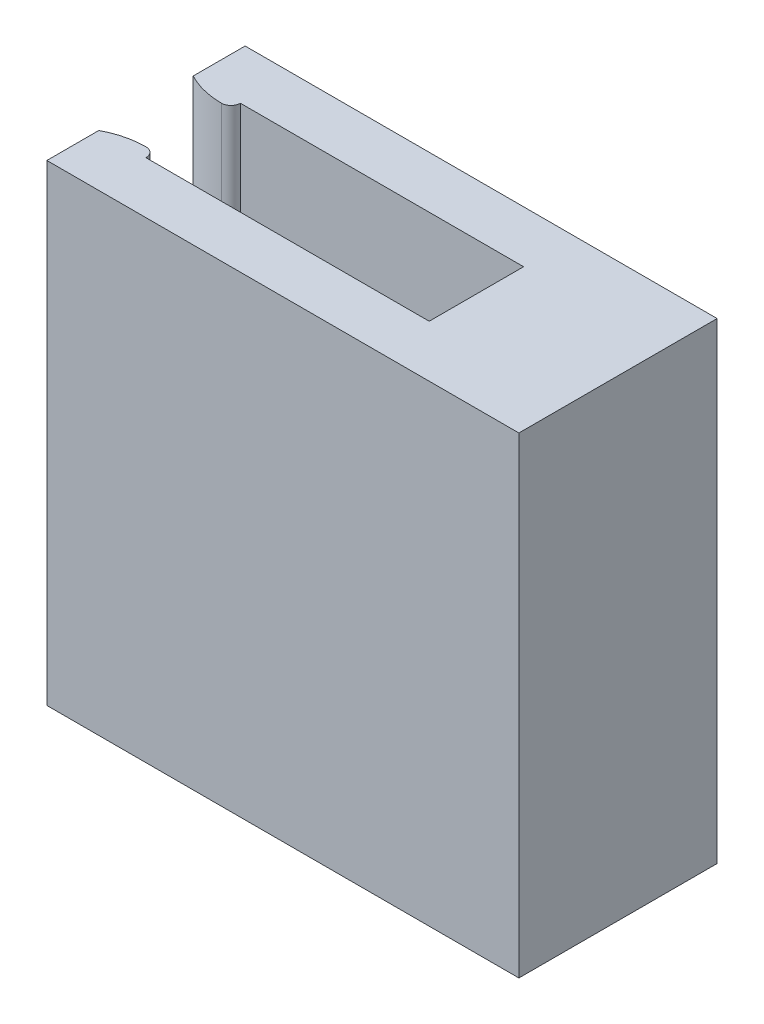
ISO-10303-21;
HEADER;
FILE_DESCRIPTION(('STEP AP214'),'2;1');
FILE_NAME('part.step','',(''),(''),'','','');
FILE_SCHEMA(('AUTOMOTIVE_DESIGN { 1 0 10303 214 1 1 1 1 }'));
ENDSEC;
DATA;
#1=APPLICATION_CONTEXT('core data for automotive mechanical design processes');
#2=APPLICATION_PROTOCOL_DEFINITION('international standard','automotive_design',2000,#1);
#3=PRODUCT_CONTEXT('',#1,'mechanical');
#4=PRODUCT('Part','Part','',(#3));
#5=PRODUCT_RELATED_PRODUCT_CATEGORY('part','',(#4));
#6=PRODUCT_DEFINITION_FORMATION('','',#4);
#7=PRODUCT_DEFINITION_CONTEXT('part definition',#1,'design');
#8=PRODUCT_DEFINITION('design','',#6,#7);
#9=PRODUCT_DEFINITION_SHAPE('','',#8);
#10=(LENGTH_UNIT() NAMED_UNIT(*) SI_UNIT(.MILLI.,.METRE.));
#11=(NAMED_UNIT(*) PLANE_ANGLE_UNIT() SI_UNIT($,.RADIAN.));
#12=(NAMED_UNIT(*) SI_UNIT($,.STERADIAN.) SOLID_ANGLE_UNIT());
#13=UNCERTAINTY_MEASURE_WITH_UNIT(LENGTH_MEASURE(1.E-05),#10,'distance_accuracy_value','');
#14=(GEOMETRIC_REPRESENTATION_CONTEXT(3) GLOBAL_UNCERTAINTY_ASSIGNED_CONTEXT((#13)) GLOBAL_UNIT_ASSIGNED_CONTEXT((#10,
#11,#12)) REPRESENTATION_CONTEXT('',''));
#15=CARTESIAN_POINT('',(0.,0.,0.));
#16=DIRECTION('',(0.,0.,1.));
#17=DIRECTION('',(1.,0.,0.));
#18=AXIS2_PLACEMENT_3D('',#15,#16,#17);
#19=CARTESIAN_POINT('',(-15.,25.,37.5));
#20=DIRECTION('',(0.,0.,-1.));
#21=DIRECTION('',(-1.,0.,0.));
#22=AXIS2_PLACEMENT_3D('',#19,#20,#21);
#23=PLANE('',#22);
#24=DIRECTION('',(1.,0.,0.));
#25=VECTOR('',#24,1.);
#26=CARTESIAN_POINT('',(-15.,-25.,37.5));
#27=LINE('',#26,#25);
#28=CARTESIAN_POINT('',(-25.,-25.,37.5));
#29=VERTEX_POINT('',#28);
#30=CARTESIAN_POINT('',(-15.,-25.,37.5));
#31=VERTEX_POINT('',#30);
#32=EDGE_CURVE('E11',#29,#31,#27,.T.);
#33=ORIENTED_EDGE('',*,*,#32,.T.);
#34=DIRECTION('',(0.,1.,0.));
#35=VECTOR('',#34,1.);
#36=CARTESIAN_POINT('',(-15.,-25.,37.5));
#37=LINE('',#36,#35);
#38=CARTESIAN_POINT('',(-15.,-15.,37.5));
#39=VERTEX_POINT('',#38);
#40=EDGE_CURVE('E167',#31,#39,#37,.T.);
#41=ORIENTED_EDGE('',*,*,#40,.T.);
#42=DIRECTION('',(-1.,0.,0.));
#43=VECTOR('',#42,1.);
#44=CARTESIAN_POINT('',(0.,-15.,37.5));
#45=LINE('',#44,#43);
#46=CARTESIAN_POINT('',(-25.,-15.,37.5));
#47=VERTEX_POINT('',#46);
#48=EDGE_CURVE('E230',#39,#47,#45,.T.);
#49=ORIENTED_EDGE('',*,*,#48,.T.);
#50=DIRECTION('',(0.,-1.,0.));
#51=VECTOR('',#50,1.);
#52=CARTESIAN_POINT('',(-25.,-15.,37.5));
#53=LINE('',#52,#51);
#54=EDGE_CURVE('E201',#47,#29,#53,.T.);
#55=ORIENTED_EDGE('',*,*,#54,.T.);
#56=EDGE_LOOP('',(#33,#41,#49,#55));
#57=FACE_BOUND('',#56,.T.);
#58=ADVANCED_FACE('F45',(#57),#23,.F.);
#59=CARTESIAN_POINT('',(0.,-25.,0.));
#60=DIRECTION('',(0.,1.,0.));
#61=DIRECTION('',(0.,0.,1.));
#62=AXIS2_PLACEMENT_3D('',#59,#60,#61);
#63=PLANE('',#62);
#64=DIRECTION('',(1.,0.,0.));
#65=VECTOR('',#64,1.);
#66=CARTESIAN_POINT('',(0.,-25.,33.3));
#67=LINE('',#66,#65);
#68=CARTESIAN_POINT('',(-25.,-25.,33.3));
#69=VERTEX_POINT('',#68);
#70=CARTESIAN_POINT('',(-15.,-25.,33.3));
#71=VERTEX_POINT('',#70);
#72=EDGE_CURVE('E166',#69,#71,#67,.T.);
#73=ORIENTED_EDGE('',*,*,#72,.T.);
#74=DIRECTION('',(0.,0.,1.));
#75=VECTOR('',#74,1.);
#76=CARTESIAN_POINT('',(-15.,-25.,-37.5));
#77=LINE('',#76,#75);
#78=EDGE_CURVE('E241',#71,#31,#77,.T.);
#79=ORIENTED_EDGE('',*,*,#78,.T.);
#80=ORIENTED_EDGE('',*,*,#32,.F.);
#81=DIRECTION('',(0.,0.,-1.));
#82=VECTOR('',#81,1.);
#83=CARTESIAN_POINT('',(-25.,-25.,0.));
#84=LINE('',#83,#82);
#85=CARTESIAN_POINT('',(-25.,-25.,36.4));
#86=VERTEX_POINT('',#85);
#87=EDGE_CURVE('E170',#29,#86,#84,.T.);
#88=ORIENTED_EDGE('',*,*,#87,.T.);
#89=CARTESIAN_POINT('',(-24.2,-25.,37.9));
#90=DIRECTION('',(0.,-1.,0.));
#91=DIRECTION('',(0.,0.,-1.));
#92=AXIS2_PLACEMENT_3D('',#89,#90,#91);
#93=CIRCLE('',#92,1.69999999999999);
#94=CARTESIAN_POINT('',(-24.2,-25.,36.2));
#95=VERTEX_POINT('',#94);
#96=EDGE_CURVE('E173',#86,#95,#93,.T.);
#97=ORIENTED_EDGE('',*,*,#96,.T.);
#98=CARTESIAN_POINT('',(-24.2,-25.,36.4));
#99=DIRECTION('',(0.,-1.,0.));
#100=DIRECTION('',(0.,0.,-1.));
#101=AXIS2_PLACEMENT_3D('',#98,#99,#100);
#102=CIRCLE('',#101,0.199999999999999);
#103=CARTESIAN_POINT('',(-24.,-25.,36.4));
#104=VERTEX_POINT('',#103);
#105=EDGE_CURVE('E176',#95,#104,#102,.T.);
#106=ORIENTED_EDGE('',*,*,#105,.T.);
#107=DIRECTION('',(1.,0.,0.));
#108=VECTOR('',#107,1.);
#109=CARTESIAN_POINT('',(0.,-25.,36.4));
#110=LINE('',#109,#108);
#111=CARTESIAN_POINT('',(-18.,-25.,36.4));
#112=VERTEX_POINT('',#111);
#113=EDGE_CURVE('E179',#104,#112,#110,.T.);
#114=ORIENTED_EDGE('',*,*,#113,.T.);
#115=DIRECTION('',(0.,0.,-1.));
#116=VECTOR('',#115,1.);
#117=CARTESIAN_POINT('',(-18.0000000000001,-25.,0.));
#118=LINE('',#117,#116);
#119=CARTESIAN_POINT('',(-18.,-25.,34.4));
#120=VERTEX_POINT('',#119);
#121=EDGE_CURVE('E182',#112,#120,#118,.T.);
#122=ORIENTED_EDGE('',*,*,#121,.T.);
#123=DIRECTION('',(-1.,0.,0.));
#124=VECTOR('',#123,1.);
#125=CARTESIAN_POINT('',(0.,-25.,34.4));
#126=LINE('',#125,#124);
#127=CARTESIAN_POINT('',(-24.,-25.,34.4));
#128=VERTEX_POINT('',#127);
#129=EDGE_CURVE('E185',#120,#128,#126,.T.);
#130=ORIENTED_EDGE('',*,*,#129,.T.);
#131=CARTESIAN_POINT('',(-24.2,-25.,34.4));
#132=DIRECTION('',(0.,-1.,0.));
#133=DIRECTION('',(0.,0.,-1.));
#134=AXIS2_PLACEMENT_3D('',#131,#132,#133);
#135=CIRCLE('',#134,0.199999999999999);
#136=CARTESIAN_POINT('',(-24.2,-25.,34.6));
#137=VERTEX_POINT('',#136);
#138=EDGE_CURVE('E148',#137,#128,#135,.F.);
#139=ORIENTED_EDGE('',*,*,#138,.F.);
#140=CARTESIAN_POINT('',(-24.2,-25.,32.9));
#141=DIRECTION('',(0.,-1.,0.));
#142=DIRECTION('',(0.,0.,-1.));
#143=AXIS2_PLACEMENT_3D('',#140,#141,#142);
#144=CIRCLE('',#143,1.69999999999999);
#145=CARTESIAN_POINT('',(-25.,-25.,34.4));
#146=VERTEX_POINT('',#145);
#147=EDGE_CURVE('E96',#146,#137,#144,.F.);
#148=ORIENTED_EDGE('',*,*,#147,.F.);
#149=DIRECTION('',(0.,0.,-1.));
#150=VECTOR('',#149,1.);
#151=CARTESIAN_POINT('',(-25.,-25.,0.));
#152=LINE('',#151,#150);
#153=EDGE_CURVE('E163',#146,#69,#152,.T.);
#154=ORIENTED_EDGE('',*,*,#153,.T.);
#155=EDGE_LOOP('',(#73,#79,#80,#88,#97,#106,#114,#122,#130,#139,#148,#154));
#156=FACE_BOUND('',#155,.T.);
#157=ADVANCED_FACE('F210',(#156),#63,.F.);
#158=CARTESIAN_POINT('',(-25.,-15.,0.));
#159=DIRECTION('',(-1.,0.,0.));
#160=DIRECTION('',(0.,0.,1.));
#161=AXIS2_PLACEMENT_3D('',#158,#159,#160);
#162=PLANE('',#161);
#163=ORIENTED_EDGE('',*,*,#153,.F.);
#164=DIRECTION('',(0.,-1.,0.));
#165=VECTOR('',#164,1.);
#166=CARTESIAN_POINT('',(-25.,-15.,34.4));
#167=LINE('',#166,#165);
#168=CARTESIAN_POINT('',(-25.,-15.,34.4));
#169=VERTEX_POINT('',#168);
#170=EDGE_CURVE('E53',#169,#146,#167,.T.);
#171=ORIENTED_EDGE('',*,*,#170,.F.);
#172=DIRECTION('',(0.,0.,-1.));
#173=VECTOR('',#172,1.);
#174=CARTESIAN_POINT('',(-25.,-15.,0.));
#175=LINE('',#174,#173);
#176=CARTESIAN_POINT('',(-25.,-15.,33.3));
#177=VERTEX_POINT('',#176);
#178=EDGE_CURVE('E189',#169,#177,#175,.T.);
#179=ORIENTED_EDGE('',*,*,#178,.T.);
#180=DIRECTION('',(0.,-1.,0.));
#181=VECTOR('',#180,1.);
#182=CARTESIAN_POINT('',(-25.,-15.,33.3));
#183=LINE('',#182,#181);
#184=EDGE_CURVE('E105',#177,#69,#183,.T.);
#185=ORIENTED_EDGE('',*,*,#184,.T.);
#186=EDGE_LOOP('',(#163,#171,#179,#185));
#187=FACE_BOUND('',#186,.T.);
#188=ADVANCED_FACE('F206',(#187),#162,.T.);
#189=CARTESIAN_POINT('',(-24.2,-15.,32.9));
#190=DIRECTION('',(0.,-1.,0.));
#191=DIRECTION('',(0.,0.,-1.));
#192=AXIS2_PLACEMENT_3D('',#189,#190,#191);
#193=CYLINDRICAL_SURFACE('',#192,1.69999999999999);
#194=ORIENTED_EDGE('',*,*,#147,.T.);
#195=DIRECTION('',(0.,-1.,0.));
#196=VECTOR('',#195,1.);
#197=CARTESIAN_POINT('',(-24.2,-15.,34.6));
#198=LINE('',#197,#196);
#199=CARTESIAN_POINT('',(-24.2,-15.,34.6));
#200=VERTEX_POINT('',#199);
#201=EDGE_CURVE('E152',#200,#137,#198,.T.);
#202=ORIENTED_EDGE('',*,*,#201,.F.);
#203=CARTESIAN_POINT('',(-24.2,-15.,32.9));
#204=DIRECTION('',(0.,-1.,0.));
#205=DIRECTION('',(0.,0.,-1.));
#206=AXIS2_PLACEMENT_3D('',#203,#204,#205);
#207=CIRCLE('',#206,1.69999999999999);
#208=EDGE_CURVE('E141',#169,#200,#207,.F.);
#209=ORIENTED_EDGE('',*,*,#208,.F.);
#210=ORIENTED_EDGE('',*,*,#170,.T.);
#211=EDGE_LOOP('',(#194,#202,#209,#210));
#212=FACE_BOUND('',#211,.T.);
#213=ADVANCED_FACE('F276',(#212),#193,.T.);
#214=CARTESIAN_POINT('',(-24.2,-15.,34.4));
#215=DIRECTION('',(0.,-1.,0.));
#216=DIRECTION('',(0.,0.,-1.));
#217=AXIS2_PLACEMENT_3D('',#214,#215,#216);
#218=CYLINDRICAL_SURFACE('',#217,0.199999999999999);
#219=ORIENTED_EDGE('',*,*,#138,.T.);
#220=DIRECTION('',(0.,-1.,0.));
#221=VECTOR('',#220,1.);
#222=CARTESIAN_POINT('',(-24.,-15.,34.4));
#223=LINE('',#222,#221);
#224=CARTESIAN_POINT('',(-24.,-15.,34.4));
#225=VERTEX_POINT('',#224);
#226=EDGE_CURVE('E145',#225,#128,#223,.T.);
#227=ORIENTED_EDGE('',*,*,#226,.F.);
#228=CARTESIAN_POINT('',(-24.2,-15.,34.4));
#229=DIRECTION('',(0.,-1.,0.));
#230=DIRECTION('',(0.,0.,-1.));
#231=AXIS2_PLACEMENT_3D('',#228,#229,#230);
#232=CIRCLE('',#231,0.199999999999999);
#233=EDGE_CURVE('E133',#200,#225,#232,.F.);
#234=ORIENTED_EDGE('',*,*,#233,.F.);
#235=ORIENTED_EDGE('',*,*,#201,.T.);
#236=EDGE_LOOP('',(#219,#227,#234,#235));
#237=FACE_BOUND('',#236,.T.);
#238=ADVANCED_FACE('F146',(#237),#218,.T.);
#239=CARTESIAN_POINT('',(0.,-15.,34.4));
#240=DIRECTION('',(0.,0.,1.));
#241=DIRECTION('',(1.,0.,0.));
#242=AXIS2_PLACEMENT_3D('',#239,#240,#241);
#243=PLANE('',#242);
#244=ORIENTED_EDGE('',*,*,#129,.F.);
#245=DIRECTION('',(0.,-1.,0.));
#246=VECTOR('',#245,1.);
#247=CARTESIAN_POINT('',(-18.,-15.,34.4));
#248=LINE('',#247,#246);
#249=CARTESIAN_POINT('',(-18.,-15.,34.4));
#250=VERTEX_POINT('',#249);
#251=EDGE_CURVE('E153',#250,#120,#248,.T.);
#252=ORIENTED_EDGE('',*,*,#251,.F.);
#253=DIRECTION('',(-1.,0.,0.));
#254=VECTOR('',#253,1.);
#255=CARTESIAN_POINT('',(0.,-15.,34.4));
#256=LINE('',#255,#254);
#257=EDGE_CURVE('E139',#250,#225,#256,.T.);
#258=ORIENTED_EDGE('',*,*,#257,.T.);
#259=ORIENTED_EDGE('',*,*,#226,.T.);
#260=EDGE_LOOP('',(#244,#252,#258,#259));
#261=FACE_BOUND('',#260,.T.);
#262=ADVANCED_FACE('F155',(#261),#243,.T.);
#263=CARTESIAN_POINT('',(-18.0000000000001,-15.,0.));
#264=DIRECTION('',(-1.,0.,0.));
#265=DIRECTION('',(0.,0.,1.));
#266=AXIS2_PLACEMENT_3D('',#263,#264,#265);
#267=PLANE('',#266);
#268=ORIENTED_EDGE('',*,*,#121,.F.);
#269=DIRECTION('',(0.,-1.,0.));
#270=VECTOR('',#269,1.);
#271=CARTESIAN_POINT('',(-18.,-15.,36.4));
#272=LINE('',#271,#270);
#273=CARTESIAN_POINT('',(-18.,-15.,36.4));
#274=VERTEX_POINT('',#273);
#275=EDGE_CURVE('E193',#274,#112,#272,.T.);
#276=ORIENTED_EDGE('',*,*,#275,.F.);
#277=DIRECTION('',(0.,0.,-1.));
#278=VECTOR('',#277,1.);
#279=CARTESIAN_POINT('',(-18.0000000000001,-15.,0.));
#280=LINE('',#279,#278);
#281=EDGE_CURVE('E156',#274,#250,#280,.T.);
#282=ORIENTED_EDGE('',*,*,#281,.T.);
#283=ORIENTED_EDGE('',*,*,#251,.T.);
#284=EDGE_LOOP('',(#268,#276,#282,#283));
#285=FACE_BOUND('',#284,.T.);
#286=ADVANCED_FACE('F214',(#285),#267,.T.);
#287=CARTESIAN_POINT('',(0.,-15.,36.4));
#288=DIRECTION('',(0.,0.,-1.));
#289=DIRECTION('',(-1.,0.,0.));
#290=AXIS2_PLACEMENT_3D('',#287,#288,#289);
#291=PLANE('',#290);
#292=ORIENTED_EDGE('',*,*,#113,.F.);
#293=DIRECTION('',(0.,-1.,0.));
#294=VECTOR('',#293,1.);
#295=CARTESIAN_POINT('',(-24.,-15.,36.4));
#296=LINE('',#295,#294);
#297=CARTESIAN_POINT('',(-24.,-15.,36.4));
#298=VERTEX_POINT('',#297);
#299=EDGE_CURVE('E195',#298,#104,#296,.T.);
#300=ORIENTED_EDGE('',*,*,#299,.F.);
#301=DIRECTION('',(1.,0.,0.));
#302=VECTOR('',#301,1.);
#303=CARTESIAN_POINT('',(0.,-15.,36.4));
#304=LINE('',#303,#302);
#305=EDGE_CURVE('E158',#298,#274,#304,.T.);
#306=ORIENTED_EDGE('',*,*,#305,.T.);
#307=ORIENTED_EDGE('',*,*,#275,.T.);
#308=EDGE_LOOP('',(#292,#300,#306,#307));
#309=FACE_BOUND('',#308,.T.);
#310=ADVANCED_FACE('F220',(#309),#291,.T.);
#311=CARTESIAN_POINT('',(-24.2,-15.,36.4));
#312=DIRECTION('',(0.,-1.,0.));
#313=DIRECTION('',(0.,0.,-1.));
#314=AXIS2_PLACEMENT_3D('',#311,#312,#313);
#315=CYLINDRICAL_SURFACE('',#314,0.199999999999999);
#316=ORIENTED_EDGE('',*,*,#105,.F.);
#317=DIRECTION('',(0.,-1.,0.));
#318=VECTOR('',#317,1.);
#319=CARTESIAN_POINT('',(-24.2,-15.,36.2));
#320=LINE('',#319,#318);
#321=CARTESIAN_POINT('',(-24.2,-15.,36.2));
#322=VERTEX_POINT('',#321);
#323=EDGE_CURVE('E197',#322,#95,#320,.T.);
#324=ORIENTED_EDGE('',*,*,#323,.F.);
#325=CARTESIAN_POINT('',(-24.2,-15.,36.4));
#326=DIRECTION('',(0.,-1.,0.));
#327=DIRECTION('',(0.,0.,-1.));
#328=AXIS2_PLACEMENT_3D('',#325,#326,#327);
#329=CIRCLE('',#328,0.199999999999999);
#330=EDGE_CURVE('E221',#322,#298,#329,.T.);
#331=ORIENTED_EDGE('',*,*,#330,.T.);
#332=ORIENTED_EDGE('',*,*,#299,.T.);
#333=EDGE_LOOP('',(#316,#324,#331,#332));
#334=FACE_BOUND('',#333,.T.);
#335=ADVANCED_FACE('F260',(#334),#315,.T.);
#336=CARTESIAN_POINT('',(-24.2,-15.,37.9));
#337=DIRECTION('',(0.,-1.,0.));
#338=DIRECTION('',(0.,0.,-1.));
#339=AXIS2_PLACEMENT_3D('',#336,#337,#338);
#340=CYLINDRICAL_SURFACE('',#339,1.69999999999999);
#341=ORIENTED_EDGE('',*,*,#96,.F.);
#342=DIRECTION('',(0.,-1.,0.));
#343=VECTOR('',#342,1.);
#344=CARTESIAN_POINT('',(-25.,-15.,36.4));
#345=LINE('',#344,#343);
#346=CARTESIAN_POINT('',(-25.,-15.,36.4));
#347=VERTEX_POINT('',#346);
#348=EDGE_CURVE('E199',#347,#86,#345,.T.);
#349=ORIENTED_EDGE('',*,*,#348,.F.);
#350=CARTESIAN_POINT('',(-24.2,-15.,37.9));
#351=DIRECTION('',(0.,-1.,0.));
#352=DIRECTION('',(0.,0.,-1.));
#353=AXIS2_PLACEMENT_3D('',#350,#351,#352);
#354=CIRCLE('',#353,1.69999999999999);
#355=EDGE_CURVE('E222',#347,#322,#354,.T.);
#356=ORIENTED_EDGE('',*,*,#355,.T.);
#357=ORIENTED_EDGE('',*,*,#323,.T.);
#358=EDGE_LOOP('',(#341,#349,#356,#357));
#359=FACE_BOUND('',#358,.T.);
#360=ADVANCED_FACE('F257',(#359),#340,.T.);
#361=CARTESIAN_POINT('',(-25.,-15.,0.));
#362=DIRECTION('',(-1.,0.,0.));
#363=DIRECTION('',(0.,0.,1.));
#364=AXIS2_PLACEMENT_3D('',#361,#362,#363);
#365=PLANE('',#364);
#366=ORIENTED_EDGE('',*,*,#87,.F.);
#367=ORIENTED_EDGE('',*,*,#54,.F.);
#368=DIRECTION('',(0.,0.,-1.));
#369=VECTOR('',#368,1.);
#370=CARTESIAN_POINT('',(-25.,-15.,0.));
#371=LINE('',#370,#369);
#372=EDGE_CURVE('E227',#47,#347,#371,.T.);
#373=ORIENTED_EDGE('',*,*,#372,.T.);
#374=ORIENTED_EDGE('',*,*,#348,.T.);
#375=EDGE_LOOP('',(#366,#367,#373,#374));
#376=FACE_BOUND('',#375,.T.);
#377=ADVANCED_FACE('F253',(#376),#365,.T.);
#378=CARTESIAN_POINT('',(0.,-15.,33.3));
#379=DIRECTION('',(0.,0.,-1.));
#380=DIRECTION('',(-1.,0.,0.));
#381=AXIS2_PLACEMENT_3D('',#378,#379,#380);
#382=PLANE('',#381);
#383=ORIENTED_EDGE('',*,*,#72,.F.);
#384=ORIENTED_EDGE('',*,*,#184,.F.);
#385=DIRECTION('',(1.,0.,0.));
#386=VECTOR('',#385,1.);
#387=CARTESIAN_POINT('',(0.,-15.,33.3));
#388=LINE('',#387,#386);
#389=CARTESIAN_POINT('',(-15.,-15.,33.3));
#390=VERTEX_POINT('',#389);
#391=EDGE_CURVE('E236',#177,#390,#388,.T.);
#392=ORIENTED_EDGE('',*,*,#391,.T.);
#393=DIRECTION('',(0.,-1.,0.));
#394=VECTOR('',#393,1.);
#395=CARTESIAN_POINT('',(-15.,-15.,33.3));
#396=LINE('',#395,#394);
#397=EDGE_CURVE('E204',#390,#71,#396,.T.);
#398=ORIENTED_EDGE('',*,*,#397,.T.);
#399=EDGE_LOOP('',(#383,#384,#392,#398));
#400=FACE_BOUND('',#399,.T.);
#401=ADVANCED_FACE('F207',(#400),#382,.T.);
#402=CARTESIAN_POINT('',(0.,-15.,0.));
#403=DIRECTION('',(0.,-1.,0.));
#404=DIRECTION('',(0.,0.,-1.));
#405=AXIS2_PLACEMENT_3D('',#402,#403,#404);
#406=PLANE('',#405);
#407=ORIENTED_EDGE('',*,*,#178,.F.);
#408=ORIENTED_EDGE('',*,*,#208,.T.);
#409=ORIENTED_EDGE('',*,*,#233,.T.);
#410=ORIENTED_EDGE('',*,*,#257,.F.);
#411=ORIENTED_EDGE('',*,*,#281,.F.);
#412=ORIENTED_EDGE('',*,*,#305,.F.);
#413=ORIENTED_EDGE('',*,*,#330,.F.);
#414=ORIENTED_EDGE('',*,*,#355,.F.);
#415=ORIENTED_EDGE('',*,*,#372,.F.);
#416=ORIENTED_EDGE('',*,*,#48,.F.);
#417=DIRECTION('',(0.,0.,-1.));
#418=VECTOR('',#417,1.);
#419=CARTESIAN_POINT('',(-15.,-15.,0.));
#420=LINE('',#419,#418);
#421=EDGE_CURVE('E233',#39,#390,#420,.T.);
#422=ORIENTED_EDGE('',*,*,#421,.T.);
#423=ORIENTED_EDGE('',*,*,#391,.F.);
#424=EDGE_LOOP('',(#407,#408,#409,#410,#411,#412,#413,#414,#415,#416,#422,#423));
#425=FACE_BOUND('',#424,.T.);
#426=ADVANCED_FACE('F136',(#425),#406,.F.);
#427=CARTESIAN_POINT('',(-15.,-25.,-37.5));
#428=DIRECTION('',(-1.,0.,0.));
#429=DIRECTION('',(0.,0.,1.));
#430=AXIS2_PLACEMENT_3D('',#427,#428,#429);
#431=PLANE('',#430);
#432=ORIENTED_EDGE('',*,*,#397,.F.);
#433=ORIENTED_EDGE('',*,*,#421,.F.);
#434=ORIENTED_EDGE('',*,*,#40,.F.);
#435=ORIENTED_EDGE('',*,*,#78,.F.);
#436=EDGE_LOOP('',(#432,#433,#434,#435));
#437=FACE_BOUND('',#436,.T.);
#438=ADVANCED_FACE('F262',(#437),#431,.F.);
#439=CLOSED_SHELL('',(#58,#157,#188,#213,#238,#262,#286,#310,#335,#360,#377,#401,#426,#438));
#440=MANIFOLD_SOLID_BREP('B2',#439);
#441=ADVANCED_BREP_SHAPE_REPRESENTATION('',(#18,#440),#14);
#442=SHAPE_DEFINITION_REPRESENTATION(#9,#441);
ENDSEC;
END-ISO-10303-21;
